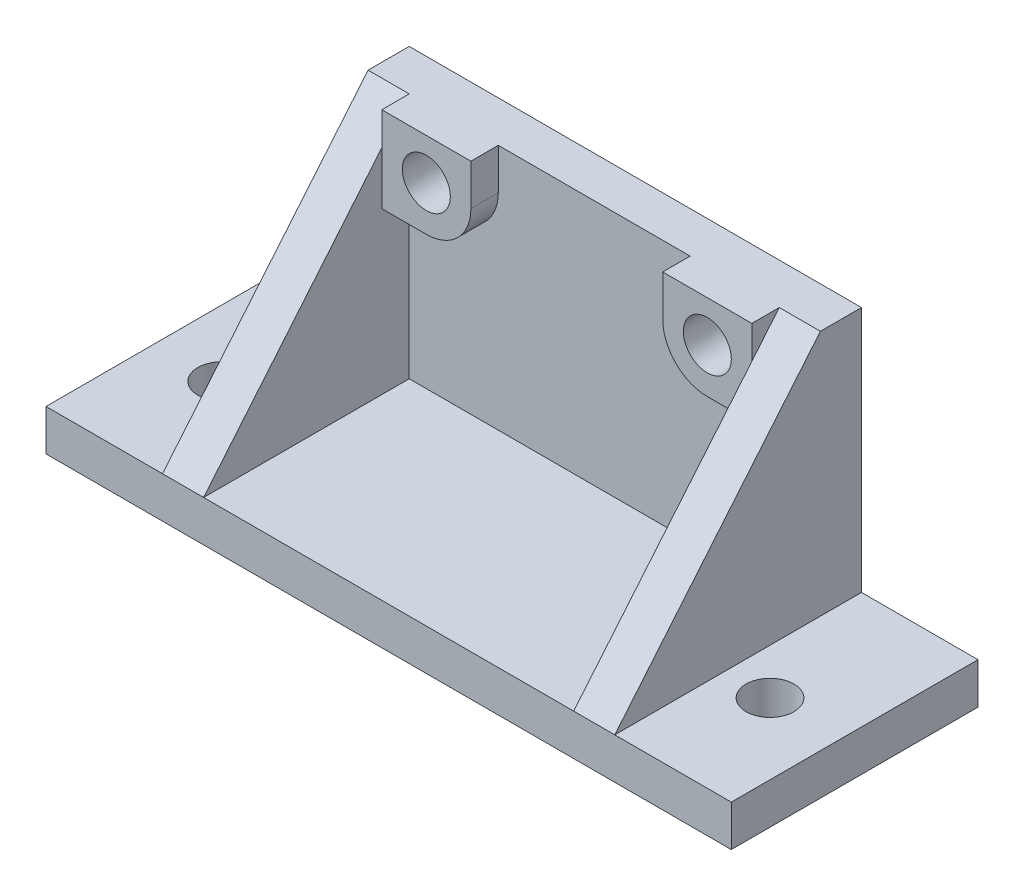
ISO-10303-21;
HEADER;
FILE_DESCRIPTION(('STEP AP214'),'2;1');
FILE_NAME('part.step','',(''),(''),'','','');
FILE_SCHEMA(('AUTOMOTIVE_DESIGN { 1 0 10303 214 1 1 1 1 }'));
ENDSEC;
DATA;
#1=APPLICATION_CONTEXT('core data for automotive mechanical design processes');
#2=APPLICATION_PROTOCOL_DEFINITION('international standard','automotive_design',2000,#1);
#3=PRODUCT_CONTEXT('',#1,'mechanical');
#4=PRODUCT('Part','Part','',(#3));
#5=PRODUCT_RELATED_PRODUCT_CATEGORY('part','',(#4));
#6=PRODUCT_DEFINITION_FORMATION('','',#4);
#7=PRODUCT_DEFINITION_CONTEXT('part definition',#1,'design');
#8=PRODUCT_DEFINITION('design','',#6,#7);
#9=PRODUCT_DEFINITION_SHAPE('','',#8);
#10=(LENGTH_UNIT() NAMED_UNIT(*) SI_UNIT(.MILLI.,.METRE.));
#11=(NAMED_UNIT(*) PLANE_ANGLE_UNIT() SI_UNIT($,.RADIAN.));
#12=(NAMED_UNIT(*) SI_UNIT($,.STERADIAN.) SOLID_ANGLE_UNIT());
#13=UNCERTAINTY_MEASURE_WITH_UNIT(LENGTH_MEASURE(1.E-05),#10,'distance_accuracy_value','');
#14=(GEOMETRIC_REPRESENTATION_CONTEXT(3) GLOBAL_UNCERTAINTY_ASSIGNED_CONTEXT((#13)) GLOBAL_UNIT_ASSIGNED_CONTEXT((#10,
#11,#12)) REPRESENTATION_CONTEXT('',''));
#15=CARTESIAN_POINT('',(0.,0.,0.));
#16=DIRECTION('',(0.,0.,1.));
#17=DIRECTION('',(1.,0.,0.));
#18=AXIS2_PLACEMENT_3D('',#15,#16,#17);
#19=CARTESIAN_POINT('',(0.,0.,3.));
#20=DIRECTION('',(0.,0.,1.));
#21=DIRECTION('',(1.,0.,0.));
#22=AXIS2_PLACEMENT_3D('',#19,#20,#21);
#23=PLANE('',#22);
#24=DIRECTION('',(-1.,0.,0.));
#25=VECTOR('',#24,1.);
#26=CARTESIAN_POINT('',(0.,0.,3.));
#27=LINE('',#26,#25);
#28=CARTESIAN_POINT('',(23.5,0.,3.));
#29=VERTEX_POINT('',#28);
#30=CARTESIAN_POINT('',(9.5,0.,3.));
#31=VERTEX_POINT('',#30);
#32=EDGE_CURVE('E336',#29,#31,#27,.T.);
#33=ORIENTED_EDGE('',*,*,#32,.T.);
#34=DIRECTION('',(0.,1.,0.));
#35=VECTOR('',#34,1.);
#36=CARTESIAN_POINT('',(9.5,0.,3.));
#37=LINE('',#36,#35);
#38=CARTESIAN_POINT('',(9.5,-3.00000000000003,3.));
#39=VERTEX_POINT('',#38);
#40=EDGE_CURVE('E57',#39,#31,#37,.T.);
#41=ORIENTED_EDGE('',*,*,#40,.F.);
#42=CARTESIAN_POINT('',(6.25,-3.00000000000003,3.));
#43=DIRECTION('',(0.,0.,1.));
#44=DIRECTION('',(1.,0.,0.));
#45=AXIS2_PLACEMENT_3D('',#42,#43,#44);
#46=CIRCLE('',#45,3.25);
#47=CARTESIAN_POINT('',(6.25,-6.25000000000003,3.));
#48=VERTEX_POINT('',#47);
#49=EDGE_CURVE('E62',#48,#39,#46,.T.);
#50=ORIENTED_EDGE('',*,*,#49,.F.);
#51=DIRECTION('',(1.,0.,0.));
#52=VECTOR('',#51,1.);
#53=CARTESIAN_POINT('',(6.25,-6.25000000000003,3.));
#54=LINE('',#53,#52);
#55=CARTESIAN_POINT('',(3.,-6.25000000000003,3.));
#56=VERTEX_POINT('',#55);
#57=EDGE_CURVE('E204',#56,#48,#54,.T.);
#58=ORIENTED_EDGE('',*,*,#57,.F.);
#59=DIRECTION('',(0.,1.,0.));
#60=VECTOR('',#59,1.);
#61=CARTESIAN_POINT('',(3.,-18.,3.));
#62=LINE('',#61,#60);
#63=CARTESIAN_POINT('',(3.,-18.,3.));
#64=VERTEX_POINT('',#63);
#65=EDGE_CURVE('E314',#64,#56,#62,.T.);
#66=ORIENTED_EDGE('',*,*,#65,.F.);
#67=DIRECTION('',(-1.,0.,0.));
#68=VECTOR('',#67,1.);
#69=CARTESIAN_POINT('',(30.,-18.,3.));
#70=LINE('',#69,#68);
#71=CARTESIAN_POINT('',(30.,-18.,3.));
#72=VERTEX_POINT('',#71);
#73=EDGE_CURVE('E319',#72,#64,#70,.T.);
#74=ORIENTED_EDGE('',*,*,#73,.F.);
#75=DIRECTION('',(0.,-1.,0.));
#76=VECTOR('',#75,1.);
#77=CARTESIAN_POINT('',(30.,0.,3.));
#78=LINE('',#77,#76);
#79=CARTESIAN_POINT('',(30.,-6.25000000000003,3.));
#80=VERTEX_POINT('',#79);
#81=EDGE_CURVE('E310',#80,#72,#78,.T.);
#82=ORIENTED_EDGE('',*,*,#81,.F.);
#83=DIRECTION('',(1.,0.,0.));
#84=VECTOR('',#83,1.);
#85=CARTESIAN_POINT('',(26.75,-6.25000000000003,3.));
#86=LINE('',#85,#84);
#87=CARTESIAN_POINT('',(26.75,-6.25000000000003,3.));
#88=VERTEX_POINT('',#87);
#89=EDGE_CURVE('E234',#88,#80,#86,.T.);
#90=ORIENTED_EDGE('',*,*,#89,.F.);
#91=CARTESIAN_POINT('',(26.75,-3.00000000000003,3.));
#92=DIRECTION('',(0.,0.,1.));
#93=DIRECTION('',(-1.,0.,0.));
#94=AXIS2_PLACEMENT_3D('',#91,#92,#93);
#95=CIRCLE('',#94,3.25);
#96=CARTESIAN_POINT('',(23.5,-3.00000000000003,3.));
#97=VERTEX_POINT('',#96);
#98=EDGE_CURVE('E238',#97,#88,#95,.T.);
#99=ORIENTED_EDGE('',*,*,#98,.F.);
#100=DIRECTION('',(0.,-1.,0.));
#101=VECTOR('',#100,1.);
#102=CARTESIAN_POINT('',(23.5,0.,3.));
#103=LINE('',#102,#101);
#104=EDGE_CURVE('E231',#29,#97,#103,.T.);
#105=ORIENTED_EDGE('',*,*,#104,.F.);
#106=EDGE_LOOP('',(#33,#41,#50,#58,#66,#74,#82,#90,#99,#105));
#107=FACE_BOUND('',#106,.T.);
#108=ADVANCED_FACE('F40',(#107),#23,.T.);
#109=CARTESIAN_POINT('',(30.,0.,18.));
#110=DIRECTION('',(1.,0.,0.));
#111=DIRECTION('',(0.,1.,0.));
#112=AXIS2_PLACEMENT_3D('',#109,#110,#111);
#113=PLANE('',#112);
#114=DIRECTION('',(0.,1.,0.));
#115=VECTOR('',#114,1.);
#116=CARTESIAN_POINT('',(30.,-6.25000000000003,5.));
#117=LINE('',#116,#115);
#118=CARTESIAN_POINT('',(30.,-6.25000000000003,5.));
#119=VERTEX_POINT('',#118);
#120=CARTESIAN_POINT('',(30.,-2.4,5.));
#121=VERTEX_POINT('',#120);
#122=EDGE_CURVE('E246',#119,#121,#117,.T.);
#123=ORIENTED_EDGE('',*,*,#122,.F.);
#124=DIRECTION('',(0.,0.,-1.));
#125=VECTOR('',#124,1.);
#126=CARTESIAN_POINT('',(30.,-6.25000000000003,5.));
#127=LINE('',#126,#125);
#128=EDGE_CURVE('E219',#119,#80,#127,.T.);
#129=ORIENTED_EDGE('',*,*,#128,.T.);
#130=ORIENTED_EDGE('',*,*,#81,.T.);
#131=DIRECTION('',(0.,0.,-1.));
#132=VECTOR('',#131,1.);
#133=CARTESIAN_POINT('',(30.,-18.,18.));
#134=LINE('',#133,#132);
#135=CARTESIAN_POINT('',(30.,-18.,18.));
#136=VERTEX_POINT('',#135);
#137=EDGE_CURVE('E326',#136,#72,#134,.T.);
#138=ORIENTED_EDGE('',*,*,#137,.F.);
#139=DIRECTION('',(0.,0.768221279597376,-0.64018439966448));
#140=VECTOR('',#139,1.);
#141=CARTESIAN_POINT('',(30.,-7.37704918032787,9.14754098360656));
#142=LINE('',#141,#140);
#143=EDGE_CURVE('E307',#136,#121,#142,.T.);
#144=ORIENTED_EDGE('',*,*,#143,.T.);
#145=EDGE_LOOP('',(#123,#129,#130,#138,#144));
#146=FACE_BOUND('',#145,.T.);
#147=ADVANCED_FACE('F440',(#146),#113,.F.);
#148=CARTESIAN_POINT('',(0.,0.,3.));
#149=DIRECTION('',(1.,0.,0.));
#150=DIRECTION('',(0.,1.,0.));
#151=AXIS2_PLACEMENT_3D('',#148,#149,#150);
#152=PLANE('',#151);
#153=DIRECTION('',(0.,0.,-1.));
#154=VECTOR('',#153,1.);
#155=CARTESIAN_POINT('',(0.,-18.,18.));
#156=LINE('',#155,#154);
#157=CARTESIAN_POINT('',(0.,-18.,18.));
#158=VERTEX_POINT('',#157);
#159=CARTESIAN_POINT('',(0.,-18.,0.));
#160=VERTEX_POINT('',#159);
#161=EDGE_CURVE('E262',#158,#160,#156,.T.);
#162=ORIENTED_EDGE('',*,*,#161,.F.);
#163=DIRECTION('',(0.,-0.768221279597376,0.64018439966448));
#164=VECTOR('',#163,1.);
#165=CARTESIAN_POINT('',(0.,0.,3.));
#166=LINE('',#165,#164);
#167=CARTESIAN_POINT('',(0.,0.,3.));
#168=VERTEX_POINT('',#167);
#169=EDGE_CURVE('E260',#168,#158,#166,.T.);
#170=ORIENTED_EDGE('',*,*,#169,.F.);
#171=DIRECTION('',(0.,0.,-1.));
#172=VECTOR('',#171,1.);
#173=CARTESIAN_POINT('',(0.,0.,3.));
#174=LINE('',#173,#172);
#175=CARTESIAN_POINT('',(0.,0.,0.));
#176=VERTEX_POINT('',#175);
#177=EDGE_CURVE('E338',#168,#176,#174,.T.);
#178=ORIENTED_EDGE('',*,*,#177,.T.);
#179=DIRECTION('',(0.,-1.,0.));
#180=VECTOR('',#179,1.);
#181=CARTESIAN_POINT('',(0.,0.,0.));
#182=LINE('',#181,#180);
#183=EDGE_CURVE('E335',#176,#160,#182,.T.);
#184=ORIENTED_EDGE('',*,*,#183,.T.);
#185=EDGE_LOOP('',(#162,#170,#178,#184));
#186=FACE_BOUND('',#185,.T.);
#187=ADVANCED_FACE('F42',(#186),#152,.F.);
#188=CARTESIAN_POINT('',(33.,0.,3.));
#189=DIRECTION('',(-1.,0.,0.));
#190=DIRECTION('',(0.,0.,1.));
#191=AXIS2_PLACEMENT_3D('',#188,#189,#190);
#192=PLANE('',#191);
#193=DIRECTION('',(0.,0.,1.));
#194=VECTOR('',#193,1.);
#195=CARTESIAN_POINT('',(33.,-18.,0.));
#196=LINE('',#195,#194);
#197=CARTESIAN_POINT('',(33.,-18.,0.));
#198=VERTEX_POINT('',#197);
#199=CARTESIAN_POINT('',(33.,-18.,18.));
#200=VERTEX_POINT('',#199);
#201=EDGE_CURVE('E266',#198,#200,#196,.T.);
#202=ORIENTED_EDGE('',*,*,#201,.F.);
#203=DIRECTION('',(0.,1.,0.));
#204=VECTOR('',#203,1.);
#205=CARTESIAN_POINT('',(33.,0.,0.));
#206=LINE('',#205,#204);
#207=CARTESIAN_POINT('',(33.,0.,0.));
#208=VERTEX_POINT('',#207);
#209=EDGE_CURVE('E343',#198,#208,#206,.T.);
#210=ORIENTED_EDGE('',*,*,#209,.T.);
#211=DIRECTION('',(0.,0.,-1.));
#212=VECTOR('',#211,1.);
#213=CARTESIAN_POINT('',(33.,0.,3.));
#214=LINE('',#213,#212);
#215=CARTESIAN_POINT('',(33.,0.,3.));
#216=VERTEX_POINT('',#215);
#217=EDGE_CURVE('E49',#216,#208,#214,.T.);
#218=ORIENTED_EDGE('',*,*,#217,.F.);
#219=DIRECTION('',(0.,-0.768221279597376,0.64018439966448));
#220=VECTOR('',#219,1.);
#221=CARTESIAN_POINT('',(33.,0.,3.));
#222=LINE('',#221,#220);
#223=EDGE_CURVE('E292',#216,#200,#222,.T.);
#224=ORIENTED_EDGE('',*,*,#223,.T.);
#225=EDGE_LOOP('',(#202,#210,#218,#224));
#226=FACE_BOUND('',#225,.T.);
#227=ADVANCED_FACE('F448',(#226),#192,.F.);
#228=CARTESIAN_POINT('',(0.,0.,0.));
#229=DIRECTION('',(0.,0.,1.));
#230=DIRECTION('',(1.,0.,0.));
#231=AXIS2_PLACEMENT_3D('',#228,#229,#230);
#232=PLANE('',#231);
#233=ORIENTED_EDGE('',*,*,#183,.F.);
#234=DIRECTION('',(-1.,0.,0.));
#235=VECTOR('',#234,1.);
#236=CARTESIAN_POINT('',(0.,0.,0.));
#237=LINE('',#236,#235);
#238=EDGE_CURVE('E339',#208,#176,#237,.T.);
#239=ORIENTED_EDGE('',*,*,#238,.F.);
#240=ORIENTED_EDGE('',*,*,#209,.F.);
#241=DIRECTION('',(-1.,0.,0.));
#242=VECTOR('',#241,1.);
#243=CARTESIAN_POINT('',(33.,-18.,0.));
#244=LINE('',#243,#242);
#245=CARTESIAN_POINT('',(41.5,-18.,0.));
#246=VERTEX_POINT('',#245);
#247=EDGE_CURVE('E280',#246,#198,#244,.T.);
#248=ORIENTED_EDGE('',*,*,#247,.F.);
#249=DIRECTION('',(0.,1.,0.));
#250=VECTOR('',#249,1.);
#251=CARTESIAN_POINT('',(41.5,-40.9060292373944,0.));
#252=LINE('',#251,#250);
#253=CARTESIAN_POINT('',(41.5,-21.,0.));
#254=VERTEX_POINT('',#253);
#255=EDGE_CURVE('E210',#254,#246,#252,.T.);
#256=ORIENTED_EDGE('',*,*,#255,.F.);
#257=DIRECTION('',(1.,0.,0.));
#258=VECTOR('',#257,1.);
#259=CARTESIAN_POINT('',(0.,-21.,0.));
#260=LINE('',#259,#258);
#261=CARTESIAN_POINT('',(-8.5,-21.,0.));
#262=VERTEX_POINT('',#261);
#263=EDGE_CURVE('E341',#262,#254,#260,.T.);
#264=ORIENTED_EDGE('',*,*,#263,.F.);
#265=DIRECTION('',(0.,1.,0.));
#266=VECTOR('',#265,1.);
#267=CARTESIAN_POINT('',(-8.49999999999999,-40.9060292373944,0.));
#268=LINE('',#267,#266);
#269=CARTESIAN_POINT('',(-8.5,-18.,0.));
#270=VERTEX_POINT('',#269);
#271=EDGE_CURVE('E275',#262,#270,#268,.T.);
#272=ORIENTED_EDGE('',*,*,#271,.T.);
#273=DIRECTION('',(-1.,0.,0.));
#274=VECTOR('',#273,1.);
#275=CARTESIAN_POINT('',(0.,-18.,0.));
#276=LINE('',#275,#274);
#277=EDGE_CURVE('E265',#160,#270,#276,.T.);
#278=ORIENTED_EDGE('',*,*,#277,.F.);
#279=EDGE_LOOP('',(#233,#239,#240,#248,#256,#264,#272,#278));
#280=FACE_BOUND('',#279,.T.);
#281=CARTESIAN_POINT('',(6.25,-3.00000000000003,0.));
#282=DIRECTION('',(0.,0.,1.));
#283=DIRECTION('',(1.,0.,0.));
#284=AXIS2_PLACEMENT_3D('',#281,#282,#283);
#285=CIRCLE('',#284,1.75);
#286=CARTESIAN_POINT('',(8.,-3.00000000000003,0.));
#287=VERTEX_POINT('',#286);
#288=EDGE_CURVE('E332',#287,#287,#285,.T.);
#289=ORIENTED_EDGE('',*,*,#288,.T.);
#290=EDGE_LOOP('',(#289));
#291=FACE_BOUND('',#290,.T.);
#292=CARTESIAN_POINT('',(26.75,-3.00000000000003,0.));
#293=DIRECTION('',(0.,0.,1.));
#294=DIRECTION('',(1.,0.,0.));
#295=AXIS2_PLACEMENT_3D('',#292,#293,#294);
#296=CIRCLE('',#295,1.75);
#297=CARTESIAN_POINT('',(28.5,-3.00000000000003,0.));
#298=VERTEX_POINT('',#297);
#299=EDGE_CURVE('E329',#298,#298,#296,.T.);
#300=ORIENTED_EDGE('',*,*,#299,.T.);
#301=EDGE_LOOP('',(#300));
#302=FACE_BOUND('',#301,.T.);
#303=ADVANCED_FACE('F461',(#280,#291,#302),#232,.F.);
#304=CARTESIAN_POINT('',(0.,-21.,3.));
#305=DIRECTION('',(0.,1.,0.));
#306=DIRECTION('',(0.,0.,1.));
#307=AXIS2_PLACEMENT_3D('',#304,#305,#306);
#308=PLANE('',#307);
#309=CARTESIAN_POINT('',(-3.6749999999965,-21.,10.));
#310=DIRECTION('',(0.,-1.,0.));
#311=DIRECTION('',(0.,0.,-1.));
#312=AXIS2_PLACEMENT_3D('',#309,#310,#311);
#313=CIRCLE('',#312,1.75000000000009);
#314=CARTESIAN_POINT('',(-3.6749999999965,-21.,8.24999999999995));
#315=VERTEX_POINT('',#314);
#316=EDGE_CURVE('E351',#315,#315,#313,.T.);
#317=ORIENTED_EDGE('',*,*,#316,.F.);
#318=EDGE_LOOP('',(#317));
#319=FACE_BOUND('',#318,.T.);
#320=CARTESIAN_POINT('',(36.3250000000035,-21.,10.));
#321=DIRECTION('',(0.,-1.,0.));
#322=DIRECTION('',(0.,0.,-1.));
#323=AXIS2_PLACEMENT_3D('',#320,#321,#322);
#324=CIRCLE('',#323,1.75000000000008);
#325=CARTESIAN_POINT('',(36.3250000000035,-21.,8.24999999999995));
#326=VERTEX_POINT('',#325);
#327=EDGE_CURVE('E356',#326,#326,#324,.T.);
#328=ORIENTED_EDGE('',*,*,#327,.F.);
#329=EDGE_LOOP('',(#328));
#330=FACE_BOUND('',#329,.T.);
#331=ORIENTED_EDGE('',*,*,#263,.T.);
#332=DIRECTION('',(0.,0.,1.));
#333=VECTOR('',#332,1.);
#334=CARTESIAN_POINT('',(41.5,-21.,0.));
#335=LINE('',#334,#333);
#336=CARTESIAN_POINT('',(41.5,-21.,18.));
#337=VERTEX_POINT('',#336);
#338=EDGE_CURVE('E207',#254,#337,#335,.T.);
#339=ORIENTED_EDGE('',*,*,#338,.T.);
#340=DIRECTION('',(1.,0.,0.));
#341=VECTOR('',#340,1.);
#342=CARTESIAN_POINT('',(0.,-21.,18.));
#343=LINE('',#342,#341);
#344=CARTESIAN_POINT('',(-8.5,-21.,18.));
#345=VERTEX_POINT('',#344);
#346=EDGE_CURVE('E311',#345,#337,#343,.T.);
#347=ORIENTED_EDGE('',*,*,#346,.F.);
#348=DIRECTION('',(0.,0.,-1.));
#349=VECTOR('',#348,1.);
#350=CARTESIAN_POINT('',(-8.5,-21.,18.));
#351=LINE('',#350,#349);
#352=EDGE_CURVE('E257',#345,#262,#351,.T.);
#353=ORIENTED_EDGE('',*,*,#352,.T.);
#354=EDGE_LOOP('',(#331,#339,#347,#353));
#355=FACE_BOUND('',#354,.T.);
#356=ADVANCED_FACE('F464',(#319,#330,#355),#308,.F.);
#357=CARTESIAN_POINT('',(0.,0.,3.));
#358=DIRECTION('',(0.,-1.,0.));
#359=DIRECTION('',(0.,0.,-1.));
#360=AXIS2_PLACEMENT_3D('',#357,#358,#359);
#361=PLANE('',#360);
#362=ORIENTED_EDGE('',*,*,#177,.F.);
#363=DIRECTION('',(-1.,0.,0.));
#364=VECTOR('',#363,1.);
#365=CARTESIAN_POINT('',(33.,0.,3.));
#366=LINE('',#365,#364);
#367=CARTESIAN_POINT('',(3.,0.,3.));
#368=VERTEX_POINT('',#367);
#369=EDGE_CURVE('E294',#368,#168,#366,.T.);
#370=ORIENTED_EDGE('',*,*,#369,.F.);
#371=DIRECTION('',(0.,0.,-1.));
#372=VECTOR('',#371,1.);
#373=CARTESIAN_POINT('',(3.,0.,5.));
#374=LINE('',#373,#372);
#375=CARTESIAN_POINT('',(3.,0.,5.));
#376=VERTEX_POINT('',#375);
#377=EDGE_CURVE('E212',#376,#368,#374,.T.);
#378=ORIENTED_EDGE('',*,*,#377,.F.);
#379=DIRECTION('',(-1.,0.,0.));
#380=VECTOR('',#379,1.);
#381=CARTESIAN_POINT('',(3.,0.,5.));
#382=LINE('',#381,#380);
#383=CARTESIAN_POINT('',(9.5,0.,5.));
#384=VERTEX_POINT('',#383);
#385=EDGE_CURVE('E192',#384,#376,#382,.T.);
#386=ORIENTED_EDGE('',*,*,#385,.F.);
#387=DIRECTION('',(0.,0.,-1.));
#388=VECTOR('',#387,1.);
#389=CARTESIAN_POINT('',(9.5,0.,5.));
#390=LINE('',#389,#388);
#391=EDGE_CURVE('E189',#384,#31,#390,.T.);
#392=ORIENTED_EDGE('',*,*,#391,.T.);
#393=ORIENTED_EDGE('',*,*,#32,.F.);
#394=DIRECTION('',(0.,0.,-1.));
#395=VECTOR('',#394,1.);
#396=CARTESIAN_POINT('',(23.5,0.,5.));
#397=LINE('',#396,#395);
#398=CARTESIAN_POINT('',(23.5,0.,5.));
#399=VERTEX_POINT('',#398);
#400=EDGE_CURVE('E224',#399,#29,#397,.T.);
#401=ORIENTED_EDGE('',*,*,#400,.F.);
#402=DIRECTION('',(-1.,0.,0.));
#403=VECTOR('',#402,1.);
#404=CARTESIAN_POINT('',(30.,0.,5.));
#405=LINE('',#404,#403);
#406=CARTESIAN_POINT('',(30.,0.,5.));
#407=VERTEX_POINT('',#406);
#408=EDGE_CURVE('E243',#407,#399,#405,.T.);
#409=ORIENTED_EDGE('',*,*,#408,.F.);
#410=DIRECTION('',(0.,0.,-1.));
#411=VECTOR('',#410,1.);
#412=CARTESIAN_POINT('',(30.,0.,5.));
#413=LINE('',#412,#411);
#414=CARTESIAN_POINT('',(30.,0.,3.));
#415=VERTEX_POINT('',#414);
#416=EDGE_CURVE('E221',#407,#415,#413,.T.);
#417=ORIENTED_EDGE('',*,*,#416,.T.);
#418=EDGE_CURVE('E301',#216,#415,#366,.T.);
#419=ORIENTED_EDGE('',*,*,#418,.F.);
#420=ORIENTED_EDGE('',*,*,#217,.T.);
#421=ORIENTED_EDGE('',*,*,#238,.T.);
#422=EDGE_LOOP('',(#362,#370,#378,#386,#392,#393,#401,#409,#417,#419,#420,#421));
#423=FACE_BOUND('',#422,.T.);
#424=ADVANCED_FACE('F386',(#423),#361,.F.);
#425=CARTESIAN_POINT('',(6.25,-3.00000000000003,3.));
#426=DIRECTION('',(0.,0.,-1.));
#427=DIRECTION('',(-1.,0.,0.));
#428=AXIS2_PLACEMENT_3D('',#425,#426,#427);
#429=CYLINDRICAL_SURFACE('',#428,1.75);
#430=ORIENTED_EDGE('',*,*,#288,.F.);
#431=EDGE_LOOP('',(#430));
#432=FACE_BOUND('',#431,.T.);
#433=CARTESIAN_POINT('',(6.25,-3.00000000000003,5.));
#434=DIRECTION('',(0.,0.,1.));
#435=DIRECTION('',(1.,0.,0.));
#436=AXIS2_PLACEMENT_3D('',#433,#434,#435);
#437=CIRCLE('',#436,1.75);
#438=CARTESIAN_POINT('',(8.,-3.00000000000003,5.));
#439=VERTEX_POINT('',#438);
#440=EDGE_CURVE('E256',#439,#439,#437,.T.);
#441=ORIENTED_EDGE('',*,*,#440,.T.);
#442=EDGE_LOOP('',(#441));
#443=FACE_BOUND('',#442,.T.);
#444=ADVANCED_FACE('F456',(#432,#443),#429,.F.);
#445=CARTESIAN_POINT('',(26.75,-3.00000000000003,3.));
#446=DIRECTION('',(0.,0.,-1.));
#447=DIRECTION('',(-1.,0.,0.));
#448=AXIS2_PLACEMENT_3D('',#445,#446,#447);
#449=CYLINDRICAL_SURFACE('',#448,1.75);
#450=ORIENTED_EDGE('',*,*,#299,.F.);
#451=EDGE_LOOP('',(#450));
#452=FACE_BOUND('',#451,.T.);
#453=CARTESIAN_POINT('',(26.75,-3.00000000000003,5.));
#454=DIRECTION('',(0.,0.,1.));
#455=DIRECTION('',(1.,0.,0.));
#456=AXIS2_PLACEMENT_3D('',#453,#454,#455);
#457=CIRCLE('',#456,1.75);
#458=CARTESIAN_POINT('',(28.5,-3.00000000000003,5.));
#459=VERTEX_POINT('',#458);
#460=EDGE_CURVE('E241',#459,#459,#457,.T.);
#461=ORIENTED_EDGE('',*,*,#460,.T.);
#462=EDGE_LOOP('',(#461));
#463=FACE_BOUND('',#462,.T.);
#464=ADVANCED_FACE('F453',(#452,#463),#449,.F.);
#465=CARTESIAN_POINT('',(30.,-18.,18.));
#466=DIRECTION('',(0.,-1.,0.));
#467=DIRECTION('',(1.,0.,0.));
#468=AXIS2_PLACEMENT_3D('',#465,#466,#467);
#469=PLANE('',#468);
#470=ORIENTED_EDGE('',*,*,#73,.T.);
#471=DIRECTION('',(0.,0.,-1.));
#472=VECTOR('',#471,1.);
#473=CARTESIAN_POINT('',(3.,-18.,18.));
#474=LINE('',#473,#472);
#475=CARTESIAN_POINT('',(3.,-18.,18.));
#476=VERTEX_POINT('',#475);
#477=EDGE_CURVE('E317',#476,#64,#474,.T.);
#478=ORIENTED_EDGE('',*,*,#477,.F.);
#479=DIRECTION('',(-1.,0.,0.));
#480=VECTOR('',#479,1.);
#481=CARTESIAN_POINT('',(30.,-18.,18.));
#482=LINE('',#481,#480);
#483=EDGE_CURVE('E313',#136,#476,#482,.T.);
#484=ORIENTED_EDGE('',*,*,#483,.F.);
#485=ORIENTED_EDGE('',*,*,#137,.T.);
#486=EDGE_LOOP('',(#470,#478,#484,#485));
#487=FACE_BOUND('',#486,.T.);
#488=ADVANCED_FACE('F410',(#487),#469,.F.);
#489=CARTESIAN_POINT('',(3.,-18.,18.));
#490=DIRECTION('',(-1.,0.,0.));
#491=DIRECTION('',(0.,0.,1.));
#492=AXIS2_PLACEMENT_3D('',#489,#490,#491);
#493=PLANE('',#492);
#494=DIRECTION('',(0.,0.,-1.));
#495=VECTOR('',#494,1.);
#496=CARTESIAN_POINT('',(3.,-6.25000000000003,5.));
#497=LINE('',#496,#495);
#498=CARTESIAN_POINT('',(3.,-6.25000000000003,5.));
#499=VERTEX_POINT('',#498);
#500=EDGE_CURVE('E376',#499,#56,#497,.T.);
#501=ORIENTED_EDGE('',*,*,#500,.F.);
#502=DIRECTION('',(0.,-1.,0.));
#503=VECTOR('',#502,1.);
#504=CARTESIAN_POINT('',(3.,-6.25000000000003,5.));
#505=LINE('',#504,#503);
#506=CARTESIAN_POINT('',(3.,-2.4,5.));
#507=VERTEX_POINT('',#506);
#508=EDGE_CURVE('E366',#507,#499,#505,.T.);
#509=ORIENTED_EDGE('',*,*,#508,.F.);
#510=DIRECTION('',(0.,-0.768221279597376,0.64018439966448));
#511=VECTOR('',#510,1.);
#512=CARTESIAN_POINT('',(3.,-18.,18.));
#513=LINE('',#512,#511);
#514=EDGE_CURVE('E300',#507,#476,#513,.T.);
#515=ORIENTED_EDGE('',*,*,#514,.T.);
#516=ORIENTED_EDGE('',*,*,#477,.T.);
#517=ORIENTED_EDGE('',*,*,#65,.T.);
#518=EDGE_LOOP('',(#501,#509,#515,#516,#517));
#519=FACE_BOUND('',#518,.T.);
#520=ADVANCED_FACE('F405',(#519),#493,.F.);
#521=CARTESIAN_POINT('',(0.,0.,18.));
#522=DIRECTION('',(0.,0.,1.));
#523=DIRECTION('',(1.,0.,0.));
#524=AXIS2_PLACEMENT_3D('',#521,#522,#523);
#525=PLANE('',#524);
#526=DIRECTION('',(1.,0.,0.));
#527=VECTOR('',#526,1.);
#528=CARTESIAN_POINT('',(0.,-18.,18.));
#529=LINE('',#528,#527);
#530=EDGE_CURVE('E11',#158,#476,#529,.T.);
#531=ORIENTED_EDGE('',*,*,#530,.F.);
#532=DIRECTION('',(1.,0.,0.));
#533=VECTOR('',#532,1.);
#534=CARTESIAN_POINT('',(0.,-18.,18.));
#535=LINE('',#534,#533);
#536=CARTESIAN_POINT('',(-8.5,-18.,18.));
#537=VERTEX_POINT('',#536);
#538=EDGE_CURVE('E272',#537,#158,#535,.T.);
#539=ORIENTED_EDGE('',*,*,#538,.F.);
#540=DIRECTION('',(0.,1.,0.));
#541=VECTOR('',#540,1.);
#542=CARTESIAN_POINT('',(-8.49999999999999,-40.9060292373944,18.));
#543=LINE('',#542,#541);
#544=EDGE_CURVE('E261',#345,#537,#543,.T.);
#545=ORIENTED_EDGE('',*,*,#544,.F.);
#546=ORIENTED_EDGE('',*,*,#346,.T.);
#547=DIRECTION('',(0.,1.,0.));
#548=VECTOR('',#547,1.);
#549=CARTESIAN_POINT('',(41.5,-40.9060292373944,18.));
#550=LINE('',#549,#548);
#551=CARTESIAN_POINT('',(41.5,-18.,18.));
#552=VERTEX_POINT('',#551);
#553=EDGE_CURVE('E278',#337,#552,#550,.T.);
#554=ORIENTED_EDGE('',*,*,#553,.T.);
#555=DIRECTION('',(1.,0.,0.));
#556=VECTOR('',#555,1.);
#557=CARTESIAN_POINT('',(33.,-18.,18.));
#558=LINE('',#557,#556);
#559=EDGE_CURVE('E287',#200,#552,#558,.T.);
#560=ORIENTED_EDGE('',*,*,#559,.F.);
#561=DIRECTION('',(-1.,0.,0.));
#562=VECTOR('',#561,1.);
#563=CARTESIAN_POINT('',(33.,-18.,18.));
#564=LINE('',#563,#562);
#565=EDGE_CURVE('E297',#200,#136,#564,.T.);
#566=ORIENTED_EDGE('',*,*,#565,.T.);
#567=ORIENTED_EDGE('',*,*,#483,.T.);
#568=EDGE_LOOP('',(#531,#539,#545,#546,#554,#560,#566,#567));
#569=FACE_BOUND('',#568,.T.);
#570=ADVANCED_FACE('F400',(#569),#525,.T.);
#571=CARTESIAN_POINT('',(33.,0.,3.));
#572=DIRECTION('',(0.,-0.64018439966448,-0.768221279597376));
#573=DIRECTION('',(0.,0.768221279597376,-0.64018439966448));
#574=AXIS2_PLACEMENT_3D('',#571,#572,#573);
#575=PLANE('',#574);
#576=ORIENTED_EDGE('',*,*,#565,.F.);
#577=ORIENTED_EDGE('',*,*,#223,.F.);
#578=ORIENTED_EDGE('',*,*,#418,.T.);
#579=EDGE_CURVE('E306',#121,#415,#142,.T.);
#580=ORIENTED_EDGE('',*,*,#579,.F.);
#581=ORIENTED_EDGE('',*,*,#143,.F.);
#582=EDGE_LOOP('',(#576,#577,#578,#580,#581));
#583=FACE_BOUND('',#582,.T.);
#584=ADVANCED_FACE('F439',(#583),#575,.F.);
#585=ORIENTED_EDGE('',*,*,#369,.T.);
#586=ORIENTED_EDGE('',*,*,#169,.T.);
#587=ORIENTED_EDGE('',*,*,#530,.T.);
#588=ORIENTED_EDGE('',*,*,#514,.F.);
#589=EDGE_CURVE('E303',#368,#507,#513,.T.);
#590=ORIENTED_EDGE('',*,*,#589,.F.);
#591=EDGE_LOOP('',(#585,#586,#587,#588,#590));
#592=FACE_BOUND('',#591,.T.);
#593=ADVANCED_FACE('F389',(#592),#575,.F.);
#594=CARTESIAN_POINT('',(41.5,-40.9060292373944,0.));
#595=DIRECTION('',(1.,0.,0.));
#596=DIRECTION('',(0.,1.,0.));
#597=AXIS2_PLACEMENT_3D('',#594,#595,#596);
#598=PLANE('',#597);
#599=ORIENTED_EDGE('',*,*,#338,.F.);
#600=ORIENTED_EDGE('',*,*,#255,.T.);
#601=DIRECTION('',(0.,0.,-1.));
#602=VECTOR('',#601,1.);
#603=CARTESIAN_POINT('',(41.5,-18.,0.));
#604=LINE('',#603,#602);
#605=EDGE_CURVE('E284',#552,#246,#604,.T.);
#606=ORIENTED_EDGE('',*,*,#605,.F.);
#607=ORIENTED_EDGE('',*,*,#553,.F.);
#608=EDGE_LOOP('',(#599,#600,#606,#607));
#609=FACE_BOUND('',#608,.T.);
#610=ADVANCED_FACE('F484',(#609),#598,.T.);
#611=CARTESIAN_POINT('',(0.,-18.,0.));
#612=DIRECTION('',(0.,1.,0.));
#613=DIRECTION('',(-1.,0.,0.));
#614=AXIS2_PLACEMENT_3D('',#611,#612,#613);
#615=PLANE('',#614);
#616=CARTESIAN_POINT('',(36.3250000000035,-18.,10.));
#617=DIRECTION('',(0.,1.,0.));
#618=DIRECTION('',(-1.,0.,0.));
#619=AXIS2_PLACEMENT_3D('',#616,#617,#618);
#620=CIRCLE('',#619,1.75000000000008);
#621=CARTESIAN_POINT('',(34.5750000000034,-18.,10.));
#622=VERTEX_POINT('',#621);
#623=EDGE_CURVE('E44',#622,#622,#620,.T.);
#624=ORIENTED_EDGE('',*,*,#623,.F.);
#625=EDGE_LOOP('',(#624));
#626=FACE_BOUND('',#625,.T.);
#627=ORIENTED_EDGE('',*,*,#201,.T.);
#628=ORIENTED_EDGE('',*,*,#559,.T.);
#629=ORIENTED_EDGE('',*,*,#605,.T.);
#630=ORIENTED_EDGE('',*,*,#247,.T.);
#631=EDGE_LOOP('',(#627,#628,#629,#630));
#632=FACE_BOUND('',#631,.T.);
#633=ADVANCED_FACE('F491',(#626,#632),#615,.T.);
#634=CARTESIAN_POINT('',(-8.49999999999999,-40.9060292373944,18.));
#635=DIRECTION('',(-1.,0.,0.));
#636=DIRECTION('',(0.,-1.,0.));
#637=AXIS2_PLACEMENT_3D('',#634,#635,#636);
#638=PLANE('',#637);
#639=ORIENTED_EDGE('',*,*,#352,.F.);
#640=ORIENTED_EDGE('',*,*,#544,.T.);
#641=DIRECTION('',(0.,0.,1.));
#642=VECTOR('',#641,1.);
#643=CARTESIAN_POINT('',(-8.5,-18.,18.));
#644=LINE('',#643,#642);
#645=EDGE_CURVE('E269',#270,#537,#644,.T.);
#646=ORIENTED_EDGE('',*,*,#645,.F.);
#647=ORIENTED_EDGE('',*,*,#271,.F.);
#648=EDGE_LOOP('',(#639,#640,#646,#647));
#649=FACE_BOUND('',#648,.T.);
#650=ADVANCED_FACE('F494',(#649),#638,.T.);
#651=CARTESIAN_POINT('',(0.,-18.,0.));
#652=DIRECTION('',(0.,1.,0.));
#653=DIRECTION('',(0.,0.,1.));
#654=AXIS2_PLACEMENT_3D('',#651,#652,#653);
#655=PLANE('',#654);
#656=CARTESIAN_POINT('',(-3.6749999999965,-18.,10.));
#657=DIRECTION('',(0.,1.,0.));
#658=DIRECTION('',(0.,0.,1.));
#659=AXIS2_PLACEMENT_3D('',#656,#657,#658);
#660=CIRCLE('',#659,1.75000000000009);
#661=CARTESIAN_POINT('',(-3.6749999999965,-18.,11.7500000000001));
#662=VERTEX_POINT('',#661);
#663=EDGE_CURVE('E349',#662,#662,#660,.T.);
#664=ORIENTED_EDGE('',*,*,#663,.F.);
#665=EDGE_LOOP('',(#664));
#666=FACE_BOUND('',#665,.T.);
#667=ORIENTED_EDGE('',*,*,#161,.T.);
#668=ORIENTED_EDGE('',*,*,#277,.T.);
#669=ORIENTED_EDGE('',*,*,#645,.T.);
#670=ORIENTED_EDGE('',*,*,#538,.T.);
#671=EDGE_LOOP('',(#667,#668,#669,#670));
#672=FACE_BOUND('',#671,.T.);
#673=ADVANCED_FACE('F395',(#666,#672),#655,.T.);
#674=CARTESIAN_POINT('',(3.,-6.25000000000003,5.));
#675=DIRECTION('',(1.,0.,0.));
#676=DIRECTION('',(0.,1.,0.));
#677=AXIS2_PLACEMENT_3D('',#674,#675,#676);
#678=PLANE('',#677);
#679=ORIENTED_EDGE('',*,*,#377,.T.);
#680=ORIENTED_EDGE('',*,*,#589,.T.);
#681=EDGE_CURVE('E367',#376,#507,#505,.T.);
#682=ORIENTED_EDGE('',*,*,#681,.F.);
#683=EDGE_LOOP('',(#679,#680,#682));
#684=FACE_BOUND('',#683,.T.);
#685=ADVANCED_FACE('F382',(#684),#678,.F.);
#686=CARTESIAN_POINT('',(6.25,-3.00000000000003,5.));
#687=DIRECTION('',(0.,0.,1.));
#688=DIRECTION('',(1.,0.,0.));
#689=AXIS2_PLACEMENT_3D('',#686,#687,#688);
#690=PLANE('',#689);
#691=CARTESIAN_POINT('',(6.25,-3.00000000000003,5.));
#692=DIRECTION('',(0.,0.,1.));
#693=DIRECTION('',(1.,0.,0.));
#694=AXIS2_PLACEMENT_3D('',#691,#692,#693);
#695=CIRCLE('',#694,3.25);
#696=CARTESIAN_POINT('',(6.25,-6.25000000000003,5.));
#697=VERTEX_POINT('',#696);
#698=CARTESIAN_POINT('',(9.5,-3.00000000000003,5.));
#699=VERTEX_POINT('',#698);
#700=EDGE_CURVE('E193',#697,#699,#695,.T.);
#701=ORIENTED_EDGE('',*,*,#700,.T.);
#702=DIRECTION('',(0.,1.,0.));
#703=VECTOR('',#702,1.);
#704=CARTESIAN_POINT('',(9.5,0.,5.));
#705=LINE('',#704,#703);
#706=EDGE_CURVE('E183',#699,#384,#705,.T.);
#707=ORIENTED_EDGE('',*,*,#706,.T.);
#708=ORIENTED_EDGE('',*,*,#385,.T.);
#709=ORIENTED_EDGE('',*,*,#681,.T.);
#710=ORIENTED_EDGE('',*,*,#508,.T.);
#711=DIRECTION('',(1.,0.,0.));
#712=VECTOR('',#711,1.);
#713=CARTESIAN_POINT('',(6.25,-6.25000000000003,5.));
#714=LINE('',#713,#712);
#715=EDGE_CURVE('E200',#499,#697,#714,.T.);
#716=ORIENTED_EDGE('',*,*,#715,.T.);
#717=EDGE_LOOP('',(#701,#707,#708,#709,#710,#716));
#718=FACE_BOUND('',#717,.T.);
#719=ORIENTED_EDGE('',*,*,#440,.F.);
#720=EDGE_LOOP('',(#719));
#721=FACE_BOUND('',#720,.T.);
#722=ADVANCED_FACE('F196',(#718,#721),#690,.T.);
#723=CARTESIAN_POINT('',(6.25,-3.00000000000003,5.));
#724=DIRECTION('',(0.,0.,-1.));
#725=DIRECTION('',(-1.,0.,0.));
#726=AXIS2_PLACEMENT_3D('',#723,#724,#725);
#727=CYLINDRICAL_SURFACE('',#726,3.25);
#728=ORIENTED_EDGE('',*,*,#49,.T.);
#729=DIRECTION('',(0.,0.,-1.));
#730=VECTOR('',#729,1.);
#731=CARTESIAN_POINT('',(9.5,-3.00000000000003,5.));
#732=LINE('',#731,#730);
#733=EDGE_CURVE('E187',#699,#39,#732,.T.);
#734=ORIENTED_EDGE('',*,*,#733,.F.);
#735=ORIENTED_EDGE('',*,*,#700,.F.);
#736=DIRECTION('',(0.,0.,-1.));
#737=VECTOR('',#736,1.);
#738=CARTESIAN_POINT('',(6.25,-6.25000000000003,5.));
#739=LINE('',#738,#737);
#740=EDGE_CURVE('E371',#697,#48,#739,.T.);
#741=ORIENTED_EDGE('',*,*,#740,.T.);
#742=EDGE_LOOP('',(#728,#734,#735,#741));
#743=FACE_BOUND('',#742,.T.);
#744=ADVANCED_FACE('F206',(#743),#727,.T.);
#745=CARTESIAN_POINT('',(9.5,0.,5.));
#746=DIRECTION('',(-1.,0.,0.));
#747=DIRECTION('',(0.,0.,1.));
#748=AXIS2_PLACEMENT_3D('',#745,#746,#747);
#749=PLANE('',#748);
#750=ORIENTED_EDGE('',*,*,#40,.T.);
#751=ORIENTED_EDGE('',*,*,#391,.F.);
#752=ORIENTED_EDGE('',*,*,#706,.F.);
#753=ORIENTED_EDGE('',*,*,#733,.T.);
#754=EDGE_LOOP('',(#750,#751,#752,#753));
#755=FACE_BOUND('',#754,.T.);
#756=ADVANCED_FACE('F185',(#755),#749,.F.);
#757=CARTESIAN_POINT('',(6.25,-6.25000000000003,5.));
#758=DIRECTION('',(0.,1.,0.));
#759=DIRECTION('',(-1.,0.,0.));
#760=AXIS2_PLACEMENT_3D('',#757,#758,#759);
#761=PLANE('',#760);
#762=ORIENTED_EDGE('',*,*,#57,.T.);
#763=ORIENTED_EDGE('',*,*,#740,.F.);
#764=ORIENTED_EDGE('',*,*,#715,.F.);
#765=ORIENTED_EDGE('',*,*,#500,.T.);
#766=EDGE_LOOP('',(#762,#763,#764,#765));
#767=FACE_BOUND('',#766,.T.);
#768=ADVANCED_FACE('F407',(#767),#761,.F.);
#769=CARTESIAN_POINT('',(30.,-6.25000000000003,5.));
#770=DIRECTION('',(-1.,0.,0.));
#771=DIRECTION('',(0.,0.,1.));
#772=AXIS2_PLACEMENT_3D('',#769,#770,#771);
#773=PLANE('',#772);
#774=EDGE_CURVE('E245',#121,#407,#117,.T.);
#775=ORIENTED_EDGE('',*,*,#774,.F.);
#776=ORIENTED_EDGE('',*,*,#579,.T.);
#777=ORIENTED_EDGE('',*,*,#416,.F.);
#778=EDGE_LOOP('',(#775,#776,#777));
#779=FACE_BOUND('',#778,.T.);
#780=ADVANCED_FACE('F436',(#779),#773,.F.);
#781=CARTESIAN_POINT('',(26.75,-3.00000000000003,5.));
#782=DIRECTION('',(0.,0.,-1.));
#783=DIRECTION('',(-1.,0.,0.));
#784=AXIS2_PLACEMENT_3D('',#781,#782,#783);
#785=PLANE('',#784);
#786=CARTESIAN_POINT('',(26.75,-3.00000000000003,5.));
#787=DIRECTION('',(0.,0.,1.));
#788=DIRECTION('',(-1.,0.,0.));
#789=AXIS2_PLACEMENT_3D('',#786,#787,#788);
#790=CIRCLE('',#789,3.25);
#791=CARTESIAN_POINT('',(23.5,-3.00000000000003,5.));
#792=VERTEX_POINT('',#791);
#793=CARTESIAN_POINT('',(26.75,-6.25000000000003,5.));
#794=VERTEX_POINT('',#793);
#795=EDGE_CURVE('E235',#792,#794,#790,.T.);
#796=ORIENTED_EDGE('',*,*,#795,.T.);
#797=DIRECTION('',(1.,0.,0.));
#798=VECTOR('',#797,1.);
#799=CARTESIAN_POINT('',(26.75,-6.25000000000003,5.));
#800=LINE('',#799,#798);
#801=EDGE_CURVE('E249',#794,#119,#800,.T.);
#802=ORIENTED_EDGE('',*,*,#801,.T.);
#803=ORIENTED_EDGE('',*,*,#122,.T.);
#804=ORIENTED_EDGE('',*,*,#774,.T.);
#805=ORIENTED_EDGE('',*,*,#408,.T.);
#806=DIRECTION('',(0.,-1.,0.));
#807=VECTOR('',#806,1.);
#808=CARTESIAN_POINT('',(23.5,0.,5.));
#809=LINE('',#808,#807);
#810=EDGE_CURVE('E230',#399,#792,#809,.T.);
#811=ORIENTED_EDGE('',*,*,#810,.T.);
#812=EDGE_LOOP('',(#796,#802,#803,#804,#805,#811));
#813=FACE_BOUND('',#812,.T.);
#814=ORIENTED_EDGE('',*,*,#460,.F.);
#815=EDGE_LOOP('',(#814));
#816=FACE_BOUND('',#815,.T.);
#817=ADVANCED_FACE('F431',(#813,#816),#785,.F.);
#818=CARTESIAN_POINT('',(26.75,-3.00000000000003,5.));
#819=DIRECTION('',(0.,0.,-1.));
#820=DIRECTION('',(-1.,0.,0.));
#821=AXIS2_PLACEMENT_3D('',#818,#819,#820);
#822=CYLINDRICAL_SURFACE('',#821,3.25);
#823=ORIENTED_EDGE('',*,*,#98,.T.);
#824=DIRECTION('',(0.,0.,-1.));
#825=VECTOR('',#824,1.);
#826=CARTESIAN_POINT('',(26.75,-6.25000000000003,5.));
#827=LINE('',#826,#825);
#828=EDGE_CURVE('E216',#794,#88,#827,.T.);
#829=ORIENTED_EDGE('',*,*,#828,.F.);
#830=ORIENTED_EDGE('',*,*,#795,.F.);
#831=DIRECTION('',(0.,0.,-1.));
#832=VECTOR('',#831,1.);
#833=CARTESIAN_POINT('',(23.5,-3.00000000000003,5.));
#834=LINE('',#833,#832);
#835=EDGE_CURVE('E227',#792,#97,#834,.T.);
#836=ORIENTED_EDGE('',*,*,#835,.T.);
#837=EDGE_LOOP('',(#823,#829,#830,#836));
#838=FACE_BOUND('',#837,.T.);
#839=ADVANCED_FACE('F420',(#838),#822,.T.);
#840=CARTESIAN_POINT('',(26.75,-6.25000000000003,5.));
#841=DIRECTION('',(0.,1.,0.));
#842=DIRECTION('',(-1.,0.,0.));
#843=AXIS2_PLACEMENT_3D('',#840,#841,#842);
#844=PLANE('',#843);
#845=ORIENTED_EDGE('',*,*,#89,.T.);
#846=ORIENTED_EDGE('',*,*,#128,.F.);
#847=ORIENTED_EDGE('',*,*,#801,.F.);
#848=ORIENTED_EDGE('',*,*,#828,.T.);
#849=EDGE_LOOP('',(#845,#846,#847,#848));
#850=FACE_BOUND('',#849,.T.);
#851=ADVANCED_FACE('F416',(#850),#844,.F.);
#852=CARTESIAN_POINT('',(23.5,0.,5.));
#853=DIRECTION('',(1.,0.,0.));
#854=DIRECTION('',(0.,0.,-1.));
#855=AXIS2_PLACEMENT_3D('',#852,#853,#854);
#856=PLANE('',#855);
#857=ORIENTED_EDGE('',*,*,#104,.T.);
#858=ORIENTED_EDGE('',*,*,#835,.F.);
#859=ORIENTED_EDGE('',*,*,#810,.F.);
#860=ORIENTED_EDGE('',*,*,#400,.T.);
#861=EDGE_LOOP('',(#857,#858,#859,#860));
#862=FACE_BOUND('',#861,.T.);
#863=ADVANCED_FACE('F424',(#862),#856,.F.);
#864=CARTESIAN_POINT('',(-3.6749999999965,0.,10.));
#865=DIRECTION('',(0.,-1.,0.));
#866=DIRECTION('',(0.,0.,-1.));
#867=AXIS2_PLACEMENT_3D('',#864,#865,#866);
#868=CYLINDRICAL_SURFACE('',#867,1.75000000000009);
#869=ORIENTED_EDGE('',*,*,#663,.T.);
#870=EDGE_LOOP('',(#869));
#871=FACE_BOUND('',#870,.T.);
#872=ORIENTED_EDGE('',*,*,#316,.T.);
#873=EDGE_LOOP('',(#872));
#874=FACE_BOUND('',#873,.T.);
#875=ADVANCED_FACE('F680',(#871,#874),#868,.F.);
#876=CARTESIAN_POINT('',(36.3250000000035,0.,10.));
#877=DIRECTION('',(0.,-1.,0.));
#878=DIRECTION('',(0.,0.,-1.));
#879=AXIS2_PLACEMENT_3D('',#876,#877,#878);
#880=CYLINDRICAL_SURFACE('',#879,1.75000000000008);
#881=ORIENTED_EDGE('',*,*,#623,.T.);
#882=EDGE_LOOP('',(#881));
#883=FACE_BOUND('',#882,.T.);
#884=ORIENTED_EDGE('',*,*,#327,.T.);
#885=EDGE_LOOP('',(#884));
#886=FACE_BOUND('',#885,.T.);
#887=ADVANCED_FACE('F688',(#883,#886),#880,.F.);
#888=CLOSED_SHELL('',(#108,#147,#187,#227,#303,#356,#424,#444,#464,#488,#520,#570,#584,#593,
#610,#633,#650,#673,#685,#722,#744,#756,#768,#780,#817,#839,#851,#863,#875,#887));
#889=MANIFOLD_SOLID_BREP('B2',#888);
#890=ADVANCED_BREP_SHAPE_REPRESENTATION('',(#18,#889),#14);
#891=SHAPE_DEFINITION_REPRESENTATION(#9,#890);
ENDSEC;
END-ISO-10303-21;
